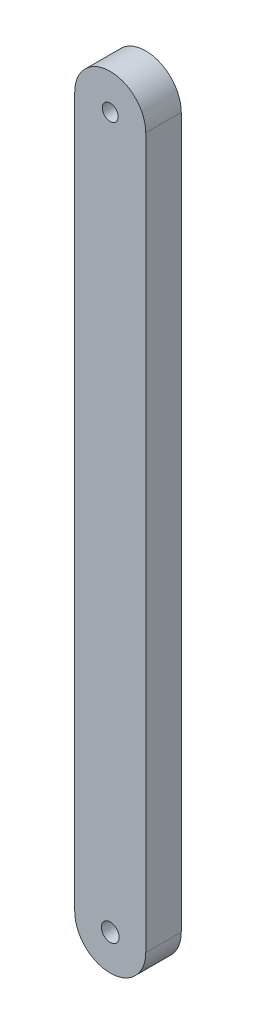
ISO-10303-21;
HEADER;
FILE_DESCRIPTION(('STEP AP214'),'2;1');
FILE_NAME('part.step','',(''),(''),'','','');
FILE_SCHEMA(('AUTOMOTIVE_DESIGN { 1 0 10303 214 1 1 1 1 }'));
ENDSEC;
DATA;
#1=APPLICATION_CONTEXT('core data for automotive mechanical design processes');
#2=APPLICATION_PROTOCOL_DEFINITION('international standard','automotive_design',2000,#1);
#3=PRODUCT_CONTEXT('',#1,'mechanical');
#4=PRODUCT('Part','Part','',(#3));
#5=PRODUCT_RELATED_PRODUCT_CATEGORY('part','',(#4));
#6=PRODUCT_DEFINITION_FORMATION('','',#4);
#7=PRODUCT_DEFINITION_CONTEXT('part definition',#1,'design');
#8=PRODUCT_DEFINITION('design','',#6,#7);
#9=PRODUCT_DEFINITION_SHAPE('','',#8);
#10=(LENGTH_UNIT() NAMED_UNIT(*) SI_UNIT(.MILLI.,.METRE.));
#11=(NAMED_UNIT(*) PLANE_ANGLE_UNIT() SI_UNIT($,.RADIAN.));
#12=(NAMED_UNIT(*) SI_UNIT($,.STERADIAN.) SOLID_ANGLE_UNIT());
#13=UNCERTAINTY_MEASURE_WITH_UNIT(LENGTH_MEASURE(1.E-05),#10,'distance_accuracy_value','');
#14=(GEOMETRIC_REPRESENTATION_CONTEXT(3) GLOBAL_UNCERTAINTY_ASSIGNED_CONTEXT((#13)) GLOBAL_UNIT_ASSIGNED_CONTEXT((#10,
#11,#12)) REPRESENTATION_CONTEXT('',''));
#15=CARTESIAN_POINT('',(0.,0.,0.));
#16=DIRECTION('',(0.,0.,1.));
#17=DIRECTION('',(1.,0.,0.));
#18=AXIS2_PLACEMENT_3D('',#15,#16,#17);
#19=CARTESIAN_POINT('',(0.,-200.000000000003,4.99999999993441));
#20=DIRECTION('',(0.,6.59819421322538E-13,-1.));
#21=DIRECTION('',(0.,1.,6.59819421322538E-13));
#22=AXIS2_PLACEMENT_3D('',#19,#20,#21);
#23=CYLINDRICAL_SURFACE('',#22,10.);
#24=CARTESIAN_POINT('',(0.,-199.999999999997,-5.00000000006559));
#25=DIRECTION('',(0.,-6.59819421322538E-13,1.));
#26=DIRECTION('',(0.,-1.,-6.59819421322538E-13));
#27=AXIS2_PLACEMENT_3D('',#24,#25,#26);
#28=CIRCLE('',#27,10.);
#29=CARTESIAN_POINT('',(10.0000000000001,-199.999999999997,-5.00000000006559));
#30=VERTEX_POINT('',#29);
#31=CARTESIAN_POINT('',(-10.,-199.999999999997,-5.00000000006559));
#32=VERTEX_POINT('',#31);
#33=EDGE_CURVE('E117',#30,#32,#28,.F.);
#34=ORIENTED_EDGE('',*,*,#33,.F.);
#35=DIRECTION('',(0.,6.59819421322538E-13,-1.));
#36=VECTOR('',#35,1.);
#37=CARTESIAN_POINT('',(10.0000000000001,-200.000000000003,4.99999999993441));
#38=LINE('',#37,#36);
#39=CARTESIAN_POINT('',(10.0000000000001,-200.000000000003,4.99999999993441));
#40=VERTEX_POINT('',#39);
#41=EDGE_CURVE('E11',#40,#30,#38,.T.);
#42=ORIENTED_EDGE('',*,*,#41,.F.);
#43=CARTESIAN_POINT('',(0.,-200.000000000003,4.99999999993441));
#44=DIRECTION('',(0.,-6.59819421322538E-13,1.));
#45=DIRECTION('',(0.,-1.,-6.59819421322538E-13));
#46=AXIS2_PLACEMENT_3D('',#43,#44,#45);
#47=CIRCLE('',#46,10.);
#48=CARTESIAN_POINT('',(-10.,-200.000000000003,4.99999999993441));
#49=VERTEX_POINT('',#48);
#50=EDGE_CURVE('E90',#40,#49,#47,.F.);
#51=ORIENTED_EDGE('',*,*,#50,.T.);
#52=DIRECTION('',(0.,6.59819421322538E-13,-1.));
#53=VECTOR('',#52,1.);
#54=CARTESIAN_POINT('',(-10.,-200.000000000003,4.99999999993441));
#55=LINE('',#54,#53);
#56=EDGE_CURVE('E58',#49,#32,#55,.T.);
#57=ORIENTED_EDGE('',*,*,#56,.T.);
#58=EDGE_LOOP('',(#34,#42,#51,#57));
#59=FACE_BOUND('',#58,.T.);
#60=ADVANCED_FACE('F40',(#59),#23,.T.);
#61=CARTESIAN_POINT('',(10.,-100.000000000003,5.00000000000039));
#62=DIRECTION('',(-1.,0.,0.));
#63=DIRECTION('',(0.,-1.,-6.59819421322538E-13));
#64=AXIS2_PLACEMENT_3D('',#61,#62,#63);
#65=PLANE('',#64);
#66=DIRECTION('',(0.,1.,6.59819421322538E-13));
#67=VECTOR('',#66,1.);
#68=CARTESIAN_POINT('',(10.,-99.9999999999963,-4.99999999999961));
#69=LINE('',#68,#67);
#70=CARTESIAN_POINT('',(10.,3.30291349825984E-12,-4.99999999993363));
#71=VERTEX_POINT('',#70);
#72=EDGE_CURVE('E97',#30,#71,#69,.T.);
#73=ORIENTED_EDGE('',*,*,#72,.T.);
#74=DIRECTION('',(0.,6.59819421322538E-13,-1.));
#75=VECTOR('',#74,1.);
#76=CARTESIAN_POINT('',(10.,-3.28903571045203E-12,5.00000000006637));
#77=LINE('',#76,#75);
#78=CARTESIAN_POINT('',(10.,-3.28903571045203E-12,5.00000000006637));
#79=VERTEX_POINT('',#78);
#80=EDGE_CURVE('E50',#79,#71,#77,.T.);
#81=ORIENTED_EDGE('',*,*,#80,.F.);
#82=DIRECTION('',(0.,1.,6.59819421322538E-13));
#83=VECTOR('',#82,1.);
#84=CARTESIAN_POINT('',(10.,-100.000000000003,5.00000000000039));
#85=LINE('',#84,#83);
#86=EDGE_CURVE('E84',#40,#79,#85,.T.);
#87=ORIENTED_EDGE('',*,*,#86,.F.);
#88=ORIENTED_EDGE('',*,*,#41,.T.);
#89=EDGE_LOOP('',(#73,#81,#87,#88));
#90=FACE_BOUND('',#89,.T.);
#91=ADVANCED_FACE('F95',(#90),#65,.F.);
#92=CARTESIAN_POINT('',(0.,-3.28903571045203E-12,5.00000000006637));
#93=DIRECTION('',(0.,6.59819421322538E-13,-1.));
#94=DIRECTION('',(0.,1.,6.59819421322538E-13));
#95=AXIS2_PLACEMENT_3D('',#92,#93,#94);
#96=CYLINDRICAL_SURFACE('',#95,10.);
#97=CARTESIAN_POINT('',(0.,3.30291349825984E-12,-4.99999999993363));
#98=DIRECTION('',(0.,-6.59819421322538E-13,1.));
#99=DIRECTION('',(0.,-1.,-6.59819421322538E-13));
#100=AXIS2_PLACEMENT_3D('',#97,#98,#99);
#101=CIRCLE('',#100,10.);
#102=CARTESIAN_POINT('',(-10.,3.30291349825984E-12,-4.99999999993363));
#103=VERTEX_POINT('',#102);
#104=EDGE_CURVE('E122',#103,#71,#101,.F.);
#105=ORIENTED_EDGE('',*,*,#104,.F.);
#106=DIRECTION('',(0.,6.59819421322538E-13,-1.));
#107=VECTOR('',#106,1.);
#108=CARTESIAN_POINT('',(-10.,-3.28903571045203E-12,5.00000000006637));
#109=LINE('',#108,#107);
#110=CARTESIAN_POINT('',(-10.,-3.28903571045203E-12,5.00000000006637));
#111=VERTEX_POINT('',#110);
#112=EDGE_CURVE('E71',#111,#103,#109,.T.);
#113=ORIENTED_EDGE('',*,*,#112,.F.);
#114=CARTESIAN_POINT('',(0.,-3.28903571045203E-12,5.00000000006637));
#115=DIRECTION('',(0.,-6.59819421322538E-13,1.));
#116=DIRECTION('',(0.,-1.,-6.59819421322538E-13));
#117=AXIS2_PLACEMENT_3D('',#114,#115,#116);
#118=CIRCLE('',#117,10.);
#119=EDGE_CURVE('E89',#111,#79,#118,.F.);
#120=ORIENTED_EDGE('',*,*,#119,.T.);
#121=ORIENTED_EDGE('',*,*,#80,.T.);
#122=EDGE_LOOP('',(#105,#113,#120,#121));
#123=FACE_BOUND('',#122,.T.);
#124=ADVANCED_FACE('F101',(#123),#96,.T.);
#125=CARTESIAN_POINT('',(0.,-200.000000000003,4.99999999993441));
#126=DIRECTION('',(0.,6.59819421322538E-13,-1.));
#127=DIRECTION('',(0.,1.,6.59819421322538E-13));
#128=AXIS2_PLACEMENT_3D('',#125,#126,#127);
#129=CYLINDRICAL_SURFACE('',#128,2.5);
#130=CARTESIAN_POINT('',(0.,-200.000000000003,4.99999999993441));
#131=DIRECTION('',(0.,-6.59819421322538E-13,1.));
#132=DIRECTION('',(0.,-1.,-6.59819421322538E-13));
#133=AXIS2_PLACEMENT_3D('',#130,#131,#132);
#134=CIRCLE('',#133,2.5);
#135=CARTESIAN_POINT('',(0.,-197.500000000003,4.99999999993605));
#136=VERTEX_POINT('',#135);
#137=EDGE_CURVE('E136',#136,#136,#134,.T.);
#138=CARTESIAN_POINT('',(0.,-199.999999999997,-5.00000000006559));
#139=DIRECTION('',(0.,-6.59819421322538E-13,1.));
#140=DIRECTION('',(0.,-1.,-6.59819421322538E-13));
#141=AXIS2_PLACEMENT_3D('',#138,#139,#140);
#142=CIRCLE('',#141,2.5);
#143=CARTESIAN_POINT('',(0.,-197.499999999997,-5.00000000006394));
#144=VERTEX_POINT('',#143);
#145=EDGE_CURVE('E113',#144,#144,#142,.T.);
#146=CARTESIAN_POINT('',(0.,-197.500000000003,4.99999999993605));
#147=CARTESIAN_POINT('',(0.,-197.500000000003,4.89583333326939));
#148=CARTESIAN_POINT('',(0.,-197.500000000003,4.79166666660272));
#149=CARTESIAN_POINT('',(0.,-197.500000000003,4.58333333326939));
#150=CARTESIAN_POINT('',(0.,-197.500000000003,4.47916666660272));
#151=CARTESIAN_POINT('',(0.,-197.500000000003,4.27083333326939));
#152=CARTESIAN_POINT('',(0.,-197.500000000003,4.16666666660272));
#153=CARTESIAN_POINT('',(0.,-197.500000000003,3.95833333326939));
#154=CARTESIAN_POINT('',(0.,-197.500000000003,3.85416666660272));
#155=CARTESIAN_POINT('',(0.,-197.500000000002,3.64583333326939));
#156=CARTESIAN_POINT('',(0.,-197.500000000002,3.54166666660272));
#157=CARTESIAN_POINT('',(0.,-197.500000000002,3.33333333326939));
#158=CARTESIAN_POINT('',(0.,-197.500000000002,3.22916666660272));
#159=CARTESIAN_POINT('',(0.,-197.500000000002,3.02083333326939));
#160=CARTESIAN_POINT('',(0.,-197.500000000002,2.91666666660272));
#161=CARTESIAN_POINT('',(0.,-197.500000000002,2.70833333326939));
#162=CARTESIAN_POINT('',(0.,-197.500000000002,2.60416666660272));
#163=CARTESIAN_POINT('',(0.,-197.500000000002,2.39583333326939));
#164=CARTESIAN_POINT('',(0.,-197.500000000001,2.29166666660272));
#165=CARTESIAN_POINT('',(0.,-197.500000000001,2.08333333326939));
#166=CARTESIAN_POINT('',(0.,-197.500000000001,1.97916666660272));
#167=CARTESIAN_POINT('',(0.,-197.500000000001,1.77083333326939));
#168=CARTESIAN_POINT('',(0.,-197.500000000001,1.66666666660272));
#169=CARTESIAN_POINT('',(0.,-197.500000000001,1.45833333326939));
#170=CARTESIAN_POINT('',(0.,-197.500000000001,1.35416666660272));
#171=CARTESIAN_POINT('',(0.,-197.500000000001,1.14583333326939));
#172=CARTESIAN_POINT('',(0.,-197.500000000001,1.04166666660272));
#173=CARTESIAN_POINT('',(0.,-197.5,0.833333333269388));
#174=CARTESIAN_POINT('',(0.,-197.5,0.729166666602722));
#175=CARTESIAN_POINT('',(0.,-197.5,0.520833333269388));
#176=CARTESIAN_POINT('',(0.,-197.5,0.416666666602722));
#177=CARTESIAN_POINT('',(0.,-197.5,0.208333333269388));
#178=CARTESIAN_POINT('',(0.,-197.5,0.104166666602721));
#179=CARTESIAN_POINT('',(0.,-197.5,-0.104166666730612));
#180=CARTESIAN_POINT('',(0.,-197.5,-0.208333333397279));
#181=CARTESIAN_POINT('',(0.,-197.5,-0.416666666730612));
#182=CARTESIAN_POINT('',(0.,-197.5,-0.520833333397279));
#183=CARTESIAN_POINT('',(0.,-197.499999999999,-0.729166666730612));
#184=CARTESIAN_POINT('',(0.,-197.499999999999,-0.833333333397279));
#185=CARTESIAN_POINT('',(0.,-197.499999999999,-1.04166666673061));
#186=CARTESIAN_POINT('',(0.,-197.499999999999,-1.14583333339728));
#187=CARTESIAN_POINT('',(0.,-197.499999999999,-1.35416666673061));
#188=CARTESIAN_POINT('',(0.,-197.499999999999,-1.45833333339728));
#189=CARTESIAN_POINT('',(0.,-197.499999999999,-1.66666666673061));
#190=CARTESIAN_POINT('',(0.,-197.499999999999,-1.77083333339728));
#191=CARTESIAN_POINT('',(0.,-197.499999999999,-1.97916666673061));
#192=CARTESIAN_POINT('',(0.,-197.499999999999,-2.08333333339728));
#193=CARTESIAN_POINT('',(0.,-197.499999999998,-2.29166666673061));
#194=CARTESIAN_POINT('',(0.,-197.499999999998,-2.39583333339728));
#195=CARTESIAN_POINT('',(0.,-197.499999999998,-2.60416666673061));
#196=CARTESIAN_POINT('',(0.,-197.499999999998,-2.70833333339728));
#197=CARTESIAN_POINT('',(0.,-197.499999999998,-2.91666666673061));
#198=CARTESIAN_POINT('',(0.,-197.499999999998,-3.02083333339728));
#199=CARTESIAN_POINT('',(0.,-197.499999999998,-3.22916666673061));
#200=CARTESIAN_POINT('',(0.,-197.499999999998,-3.33333333339728));
#201=CARTESIAN_POINT('',(0.,-197.499999999998,-3.54166666673061));
#202=CARTESIAN_POINT('',(0.,-197.499999999998,-3.64583333339728));
#203=CARTESIAN_POINT('',(0.,-197.499999999997,-3.85416666673061));
#204=CARTESIAN_POINT('',(0.,-197.499999999997,-3.95833333339728));
#205=CARTESIAN_POINT('',(0.,-197.499999999997,-4.16666666673061));
#206=CARTESIAN_POINT('',(0.,-197.499999999997,-4.27083333339728));
#207=CARTESIAN_POINT('',(0.,-197.499999999997,-4.47916666673061));
#208=CARTESIAN_POINT('',(0.,-197.499999999997,-4.58333333339728));
#209=CARTESIAN_POINT('',(0.,-197.499999999997,-4.79166666673061));
#210=CARTESIAN_POINT('',(0.,-197.499999999997,-4.89583333339728));
#211=CARTESIAN_POINT('',(0.,-197.499999999997,-5.00000000006394));
#212=B_SPLINE_CURVE_WITH_KNOTS('',3,(#146,#147,#148,#149,#150,#151,#152,#153,#154,#155,#156,
#157,#158,#159,#160,#161,#162,#163,#164,#165,#166,#167,#168,#169,#170,#171,#172,#173,#174,#175,
#176,#177,#178,#179,#180,#181,#182,#183,#184,#185,#186,#187,#188,#189,#190,#191,#192,#193,#194,
#195,#196,#197,#198,#199,#200,#201,#202,#203,#204,#205,#206,#207,#208,#209,#210,#211),
.UNSPECIFIED.,.F.,.F.,(4,2,2,2,2,2,2,2,2,2,2,2,2,2,2,2,2,2,2,2,2,2,2,2,2,2,2,2,2,2,2,2,4),(0.,
0.312499999999999,0.625,0.9375,1.25,1.5625,1.875,2.1875,2.5,2.8125,3.125,3.4375,3.75,4.0625,
4.375,4.6875,5.,5.3125,5.625,5.9375,6.25,6.5625,6.875,7.1875,7.5,7.8125,8.125,8.4375,8.75,
9.0625,9.375,9.6875,10.),.UNSPECIFIED.);
#213=EDGE_CURVE('BSEAM154',#136,#144,#212,.T.);
#214=ORIENTED_EDGE('',*,*,#137,.T.);
#215=ORIENTED_EDGE('',*,*,#145,.F.);
#216=ORIENTED_EDGE('',*,*,#213,.T.);
#217=ORIENTED_EDGE('',*,*,#213,.F.);
#218=EDGE_LOOP('',(#214,#216,#215,#217));
#219=FACE_BOUND('',#218,.T.);
#220=ADVANCED_FACE('F154',(#219),#129,.F.);
#221=CARTESIAN_POINT('',(0.,-3.28903571045203E-12,5.00000000006637));
#222=DIRECTION('',(0.,6.59819421322538E-13,-1.));
#223=DIRECTION('',(0.,1.,6.59819421322538E-13));
#224=AXIS2_PLACEMENT_3D('',#221,#222,#223);
#225=CYLINDRICAL_SURFACE('',#224,2.24506403026728);
#226=CARTESIAN_POINT('',(0.,-3.28903571045203E-12,5.00000000006637));
#227=DIRECTION('',(0.,-6.59819421322538E-13,1.));
#228=DIRECTION('',(0.,-1.,-6.59819421322538E-13));
#229=AXIS2_PLACEMENT_3D('',#226,#227,#228);
#230=CIRCLE('',#229,2.24506403026728);
#231=CARTESIAN_POINT('',(0.,2.24506403026399,5.00000000006785));
#232=VERTEX_POINT('',#231);
#233=EDGE_CURVE('E129',#232,#232,#230,.T.);
#234=CARTESIAN_POINT('',(0.,3.30291349825984E-12,-4.99999999993363));
#235=DIRECTION('',(0.,-6.59819421322538E-13,1.));
#236=DIRECTION('',(0.,-1.,-6.59819421322538E-13));
#237=AXIS2_PLACEMENT_3D('',#234,#235,#236);
#238=CIRCLE('',#237,2.24506403026728);
#239=CARTESIAN_POINT('',(0.,2.24506403027059,-4.99999999993215));
#240=VERTEX_POINT('',#239);
#241=EDGE_CURVE('E109',#240,#240,#238,.T.);
#242=CARTESIAN_POINT('',(0.,2.24506403026399,5.00000000006785));
#243=CARTESIAN_POINT('',(0.,2.24506403026406,4.89583333340118));
#244=CARTESIAN_POINT('',(0.,2.24506403026413,4.79166666673452));
#245=CARTESIAN_POINT('',(0.,2.24506403026427,4.58333333340118));
#246=CARTESIAN_POINT('',(0.,2.24506403026434,4.47916666673452));
#247=CARTESIAN_POINT('',(0.,2.24506403026447,4.27083333340118));
#248=CARTESIAN_POINT('',(0.,2.24506403026454,4.16666666673452));
#249=CARTESIAN_POINT('',(0.,2.24506403026468,3.95833333340118));
#250=CARTESIAN_POINT('',(0.,2.24506403026475,3.85416666673452));
#251=CARTESIAN_POINT('',(0.,2.24506403026489,3.64583333340118));
#252=CARTESIAN_POINT('',(0.,2.24506403026495,3.54166666673452));
#253=CARTESIAN_POINT('',(0.,2.24506403026509,3.33333333340118));
#254=CARTESIAN_POINT('',(0.,2.24506403026516,3.22916666673452));
#255=CARTESIAN_POINT('',(0.,2.2450640302653,3.02083333340118));
#256=CARTESIAN_POINT('',(0.,2.24506403026537,2.91666666673452));
#257=CARTESIAN_POINT('',(0.,2.2450640302655,2.70833333340118));
#258=CARTESIAN_POINT('',(0.,2.24506403026557,2.60416666673452));
#259=CARTESIAN_POINT('',(0.,2.24506403026571,2.39583333340118));
#260=CARTESIAN_POINT('',(0.,2.24506403026578,2.29166666673452));
#261=CARTESIAN_POINT('',(0.,2.24506403026592,2.08333333340118));
#262=CARTESIAN_POINT('',(0.,2.24506403026599,1.97916666673452));
#263=CARTESIAN_POINT('',(0.,2.24506403026612,1.77083333340118));
#264=CARTESIAN_POINT('',(0.,2.24506403026619,1.66666666673452));
#265=CARTESIAN_POINT('',(0.,2.24506403026633,1.45833333340118));
#266=CARTESIAN_POINT('',(0.,2.2450640302664,1.35416666673452));
#267=CARTESIAN_POINT('',(0.,2.24506403026654,1.14583333340118));
#268=CARTESIAN_POINT('',(0.,2.2450640302666,1.04166666673452));
#269=CARTESIAN_POINT('',(0.,2.24506403026674,0.833333333401184));
#270=CARTESIAN_POINT('',(0.,2.24506403026681,0.729166666734517));
#271=CARTESIAN_POINT('',(0.,2.24506403026695,0.520833333401184));
#272=CARTESIAN_POINT('',(0.,2.24506403026702,0.416666666734517));
#273=CARTESIAN_POINT('',(0.,2.24506403026715,0.208333333401184));
#274=CARTESIAN_POINT('',(0.,2.24506403026722,0.104166666734517));
#275=CARTESIAN_POINT('',(0.,2.24506403026736,-0.104166666598817));
#276=CARTESIAN_POINT('',(0.,2.24506403026743,-0.208333333265483));
#277=CARTESIAN_POINT('',(0.,2.24506403026757,-0.416666666598817));
#278=CARTESIAN_POINT('',(0.,2.24506403026764,-0.520833333265484));
#279=CARTESIAN_POINT('',(0.,2.24506403026777,-0.729166666598817));
#280=CARTESIAN_POINT('',(0.,2.24506403026784,-0.833333333265483));
#281=CARTESIAN_POINT('',(0.,2.24506403026798,-1.04166666659882));
#282=CARTESIAN_POINT('',(0.,2.24506403026805,-1.14583333326548));
#283=CARTESIAN_POINT('',(0.,2.24506403026819,-1.35416666659882));
#284=CARTESIAN_POINT('',(0.,2.24506403026825,-1.45833333326548));
#285=CARTESIAN_POINT('',(0.,2.24506403026839,-1.66666666659882));
#286=CARTESIAN_POINT('',(0.,2.24506403026846,-1.77083333326548));
#287=CARTESIAN_POINT('',(0.,2.2450640302686,-1.97916666659882));
#288=CARTESIAN_POINT('',(0.,2.24506403026867,-2.08333333326548));
#289=CARTESIAN_POINT('',(0.,2.2450640302688,-2.29166666659882));
#290=CARTESIAN_POINT('',(0.,2.24506403026887,-2.39583333326548));
#291=CARTESIAN_POINT('',(0.,2.24506403026901,-2.60416666659882));
#292=CARTESIAN_POINT('',(0.,2.24506403026908,-2.70833333326548));
#293=CARTESIAN_POINT('',(0.,2.24506403026922,-2.91666666659882));
#294=CARTESIAN_POINT('',(0.,2.24506403026929,-3.02083333326548));
#295=CARTESIAN_POINT('',(0.,2.24506403026942,-3.22916666659882));
#296=CARTESIAN_POINT('',(0.,2.24506403026949,-3.33333333326548));
#297=CARTESIAN_POINT('',(0.,2.24506403026963,-3.54166666659882));
#298=CARTESIAN_POINT('',(0.,2.2450640302697,-3.64583333326548));
#299=CARTESIAN_POINT('',(0.,2.24506403026984,-3.85416666659881));
#300=CARTESIAN_POINT('',(0.,2.2450640302699,-3.95833333326548));
#301=CARTESIAN_POINT('',(0.,2.24506403027004,-4.16666666659881));
#302=CARTESIAN_POINT('',(0.,2.24506403027011,-4.27083333326548));
#303=CARTESIAN_POINT('',(0.,2.24506403027025,-4.47916666659881));
#304=CARTESIAN_POINT('',(0.,2.24506403027032,-4.58333333326548));
#305=CARTESIAN_POINT('',(0.,2.24506403027045,-4.79166666659882));
#306=CARTESIAN_POINT('',(0.,2.24506403027052,-4.89583333326548));
#307=CARTESIAN_POINT('',(0.,2.24506403027059,-4.99999999993215));
#308=B_SPLINE_CURVE_WITH_KNOTS('',3,(#242,#243,#244,#245,#246,#247,#248,#249,#250,#251,#252,
#253,#254,#255,#256,#257,#258,#259,#260,#261,#262,#263,#264,#265,#266,#267,#268,#269,#270,#271,
#272,#273,#274,#275,#276,#277,#278,#279,#280,#281,#282,#283,#284,#285,#286,#287,#288,#289,#290,
#291,#292,#293,#294,#295,#296,#297,#298,#299,#300,#301,#302,#303,#304,#305,#306,#307),
.UNSPECIFIED.,.F.,.F.,(4,2,2,2,2,2,2,2,2,2,2,2,2,2,2,2,2,2,2,2,2,2,2,2,2,2,2,2,2,2,2,2,4),(0.,
0.312499999999999,0.625,0.9375,1.25,1.5625,1.875,2.1875,2.5,2.8125,3.125,3.4375,3.75,4.0625,
4.375,4.6875,5.,5.3125,5.625,5.9375,6.25,6.5625,6.875,7.1875,7.5,7.8125,8.125,8.4375,8.75,
9.0625,9.375,9.6875,10.),.UNSPECIFIED.);
#309=EDGE_CURVE('BSEAM42',#232,#240,#308,.T.);
#310=ORIENTED_EDGE('',*,*,#233,.T.);
#311=ORIENTED_EDGE('',*,*,#241,.F.);
#312=ORIENTED_EDGE('',*,*,#309,.T.);
#313=ORIENTED_EDGE('',*,*,#309,.F.);
#314=EDGE_LOOP('',(#310,#312,#311,#313));
#315=FACE_BOUND('',#314,.T.);
#316=ADVANCED_FACE('F42',(#315),#225,.F.);
#317=CARTESIAN_POINT('',(-10.,-100.000000000003,5.00000000000039));
#318=DIRECTION('',(-1.,0.,0.));
#319=DIRECTION('',(0.,-1.,-6.59819421322538E-13));
#320=AXIS2_PLACEMENT_3D('',#317,#318,#319);
#321=PLANE('',#320);
#322=DIRECTION('',(0.,1.,6.59819421322538E-13));
#323=VECTOR('',#322,1.);
#324=CARTESIAN_POINT('',(-10.,-99.9999999999963,-4.99999999999961));
#325=LINE('',#324,#323);
#326=EDGE_CURVE('E125',#32,#103,#325,.T.);
#327=ORIENTED_EDGE('',*,*,#326,.F.);
#328=ORIENTED_EDGE('',*,*,#56,.F.);
#329=DIRECTION('',(0.,1.,6.59819421322538E-13));
#330=VECTOR('',#329,1.);
#331=CARTESIAN_POINT('',(-10.,-100.000000000003,5.00000000000039));
#332=LINE('',#331,#330);
#333=EDGE_CURVE('E103',#49,#111,#332,.T.);
#334=ORIENTED_EDGE('',*,*,#333,.T.);
#335=ORIENTED_EDGE('',*,*,#112,.T.);
#336=EDGE_LOOP('',(#327,#328,#334,#335));
#337=FACE_BOUND('',#336,.T.);
#338=ADVANCED_FACE('F144',(#337),#321,.T.);
#339=CARTESIAN_POINT('',(0.,-100.000000000003,5.00000000000039));
#340=DIRECTION('',(0.,-6.59819421322538E-13,1.));
#341=DIRECTION('',(0.,-1.,-6.59819421322538E-13));
#342=AXIS2_PLACEMENT_3D('',#339,#340,#341);
#343=PLANE('',#342);
#344=ORIENTED_EDGE('',*,*,#233,.F.);
#345=EDGE_LOOP('',(#344));
#346=FACE_BOUND('',#345,.T.);
#347=ORIENTED_EDGE('',*,*,#137,.F.);
#348=EDGE_LOOP('',(#347));
#349=FACE_BOUND('',#348,.T.);
#350=ORIENTED_EDGE('',*,*,#50,.F.);
#351=ORIENTED_EDGE('',*,*,#86,.T.);
#352=ORIENTED_EDGE('',*,*,#119,.F.);
#353=ORIENTED_EDGE('',*,*,#333,.F.);
#354=EDGE_LOOP('',(#350,#351,#352,#353));
#355=FACE_BOUND('',#354,.T.);
#356=ADVANCED_FACE('F86',(#346,#349,#355),#343,.T.);
#357=CARTESIAN_POINT('',(0.,-99.9999999999963,-4.99999999999961));
#358=DIRECTION('',(0.,-6.59819421322538E-13,1.));
#359=DIRECTION('',(0.,-1.,-6.59819421322538E-13));
#360=AXIS2_PLACEMENT_3D('',#357,#358,#359);
#361=PLANE('',#360);
#362=ORIENTED_EDGE('',*,*,#241,.T.);
#363=EDGE_LOOP('',(#362));
#364=FACE_BOUND('',#363,.T.);
#365=ORIENTED_EDGE('',*,*,#145,.T.);
#366=EDGE_LOOP('',(#365));
#367=FACE_BOUND('',#366,.T.);
#368=ORIENTED_EDGE('',*,*,#33,.T.);
#369=ORIENTED_EDGE('',*,*,#326,.T.);
#370=ORIENTED_EDGE('',*,*,#104,.T.);
#371=ORIENTED_EDGE('',*,*,#72,.F.);
#372=EDGE_LOOP('',(#368,#369,#370,#371));
#373=FACE_BOUND('',#372,.T.);
#374=ADVANCED_FACE('F151',(#364,#367,#373),#361,.F.);
#375=CLOSED_SHELL('',(#60,#91,#124,#220,#316,#338,#356,#374));
#376=MANIFOLD_SOLID_BREP('B2',#375);
#377=ADVANCED_BREP_SHAPE_REPRESENTATION('',(#18,#376),#14);
#378=SHAPE_DEFINITION_REPRESENTATION(#9,#377);
ENDSEC;
END-ISO-10303-21;
